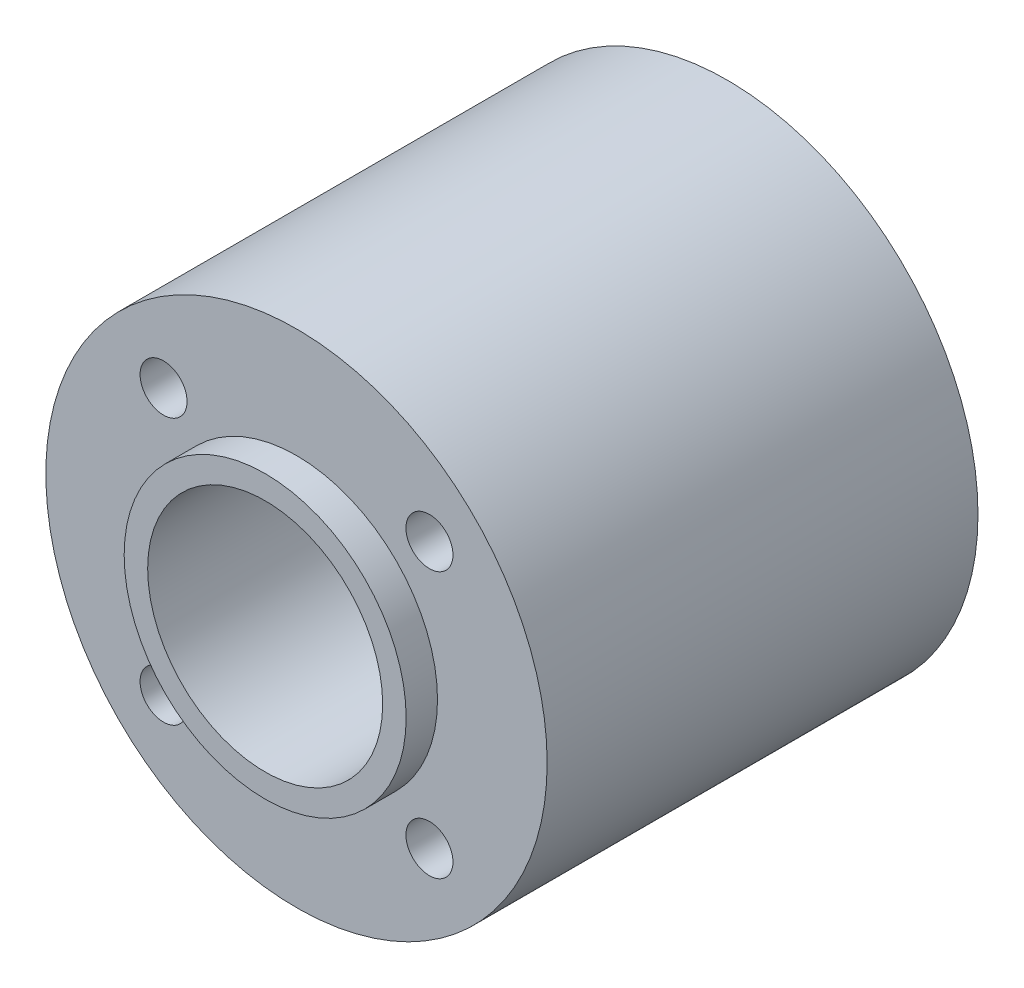
ISO-10303-21;
HEADER;
FILE_DESCRIPTION(('STEP AP214'),'2;1');
FILE_NAME('part.step','',(''),(''),'','','');
FILE_SCHEMA(('AUTOMOTIVE_DESIGN { 1 0 10303 214 1 1 1 1 }'));
ENDSEC;
DATA;
#1=APPLICATION_CONTEXT('core data for automotive mechanical design processes');
#2=APPLICATION_PROTOCOL_DEFINITION('international standard','automotive_design',2000,#1);
#3=PRODUCT_CONTEXT('',#1,'mechanical');
#4=PRODUCT('Part','Part','',(#3));
#5=PRODUCT_RELATED_PRODUCT_CATEGORY('part','',(#4));
#6=PRODUCT_DEFINITION_FORMATION('','',#4);
#7=PRODUCT_DEFINITION_CONTEXT('part definition',#1,'design');
#8=PRODUCT_DEFINITION('design','',#6,#7);
#9=PRODUCT_DEFINITION_SHAPE('','',#8);
#10=(LENGTH_UNIT() NAMED_UNIT(*) SI_UNIT(.MILLI.,.METRE.));
#11=(NAMED_UNIT(*) PLANE_ANGLE_UNIT() SI_UNIT($,.RADIAN.));
#12=(NAMED_UNIT(*) SI_UNIT($,.STERADIAN.) SOLID_ANGLE_UNIT());
#13=UNCERTAINTY_MEASURE_WITH_UNIT(LENGTH_MEASURE(1.E-05),#10,'distance_accuracy_value','');
#14=(GEOMETRIC_REPRESENTATION_CONTEXT(3) GLOBAL_UNCERTAINTY_ASSIGNED_CONTEXT((#13)) GLOBAL_UNIT_ASSIGNED_CONTEXT((#10,
#11,#12)) REPRESENTATION_CONTEXT('',''));
#15=CARTESIAN_POINT('',(0.,0.,0.));
#16=DIRECTION('',(0.,0.,1.));
#17=DIRECTION('',(1.,0.,0.));
#18=AXIS2_PLACEMENT_3D('',#15,#16,#17);
#19=CARTESIAN_POINT('',(0.,0.,27.5));
#20=DIRECTION('',(0.,0.,-1.));
#21=DIRECTION('',(-1.,0.,0.));
#22=AXIS2_PLACEMENT_3D('',#19,#20,#21);
#23=CYLINDRICAL_SURFACE('',#22,16.);
#24=CARTESIAN_POINT('',(0.,0.,27.5));
#25=DIRECTION('',(0.,0.,1.));
#26=DIRECTION('',(1.,0.,0.));
#27=AXIS2_PLACEMENT_3D('',#24,#25,#26);
#28=CIRCLE('',#27,16.);
#29=CARTESIAN_POINT('',(16.,0.,27.5));
#30=VERTEX_POINT('',#29);
#31=EDGE_CURVE('E47',#30,#30,#28,.T.);
#32=ORIENTED_EDGE('',*,*,#31,.F.);
#33=EDGE_LOOP('',(#32));
#34=FACE_BOUND('',#33,.T.);
#35=CARTESIAN_POINT('',(0.,0.,0.));
#36=DIRECTION('',(0.,0.,1.));
#37=DIRECTION('',(1.,0.,0.));
#38=AXIS2_PLACEMENT_3D('',#35,#36,#37);
#39=CIRCLE('',#38,16.);
#40=CARTESIAN_POINT('',(16.,0.,0.));
#41=VERTEX_POINT('',#40);
#42=EDGE_CURVE('E62',#41,#41,#39,.T.);
#43=ORIENTED_EDGE('',*,*,#42,.T.);
#44=EDGE_LOOP('',(#43));
#45=FACE_BOUND('',#44,.T.);
#46=ADVANCED_FACE('F39',(#34,#45),#23,.T.);
#47=CARTESIAN_POINT('',(-8.48528137423862,8.48528137423853,27.5));
#48=DIRECTION('',(0.,0.,-1.));
#49=DIRECTION('',(-1.,0.,0.));
#50=AXIS2_PLACEMENT_3D('',#47,#48,#49);
#51=CYLINDRICAL_SURFACE('',#50,1.5);
#52=CARTESIAN_POINT('',(-8.48528137423862,8.48528137423853,27.5));
#53=DIRECTION('',(0.,0.,1.));
#54=DIRECTION('',(1.,0.,0.));
#55=AXIS2_PLACEMENT_3D('',#52,#53,#54);
#56=CIRCLE('',#55,1.5);
#57=CARTESIAN_POINT('',(-6.98528137423862,8.48528137423853,27.5));
#58=VERTEX_POINT('',#57);
#59=EDGE_CURVE('E52',#58,#58,#56,.T.);
#60=ORIENTED_EDGE('',*,*,#59,.T.);
#61=EDGE_LOOP('',(#60));
#62=FACE_BOUND('',#61,.T.);
#63=CARTESIAN_POINT('',(-8.48528137423862,8.48528137423853,0.));
#64=DIRECTION('',(0.,0.,1.));
#65=DIRECTION('',(1.,0.,0.));
#66=AXIS2_PLACEMENT_3D('',#63,#64,#65);
#67=CIRCLE('',#66,1.5);
#68=CARTESIAN_POINT('',(-6.98528137423862,8.48528137423853,0.));
#69=VERTEX_POINT('',#68);
#70=EDGE_CURVE('E79',#69,#69,#67,.T.);
#71=ORIENTED_EDGE('',*,*,#70,.F.);
#72=EDGE_LOOP('',(#71));
#73=FACE_BOUND('',#72,.T.);
#74=ADVANCED_FACE('F105',(#62,#73),#51,.F.);
#75=CARTESIAN_POINT('',(8.48528137423857,8.48528137423905,27.5));
#76=DIRECTION('',(0.,0.,-1.));
#77=DIRECTION('',(-1.,0.,0.));
#78=AXIS2_PLACEMENT_3D('',#75,#76,#77);
#79=CYLINDRICAL_SURFACE('',#78,1.50000000000044);
#80=CARTESIAN_POINT('',(8.48528137423857,8.48528137423905,27.5));
#81=DIRECTION('',(0.,0.,1.));
#82=DIRECTION('',(1.,0.,0.));
#83=AXIS2_PLACEMENT_3D('',#80,#81,#82);
#84=CIRCLE('',#83,1.50000000000044);
#85=CARTESIAN_POINT('',(9.98528137423901,8.48528137423905,27.5));
#86=VERTEX_POINT('',#85);
#87=EDGE_CURVE('E65',#86,#86,#84,.T.);
#88=ORIENTED_EDGE('',*,*,#87,.T.);
#89=EDGE_LOOP('',(#88));
#90=FACE_BOUND('',#89,.T.);
#91=CARTESIAN_POINT('',(8.48528137423857,8.48528137423905,0.));
#92=DIRECTION('',(0.,0.,1.));
#93=DIRECTION('',(1.,0.,0.));
#94=AXIS2_PLACEMENT_3D('',#91,#92,#93);
#95=CIRCLE('',#94,1.50000000000044);
#96=CARTESIAN_POINT('',(9.98528137423901,8.48528137423905,0.));
#97=VERTEX_POINT('',#96);
#98=EDGE_CURVE('E76',#97,#97,#95,.T.);
#99=ORIENTED_EDGE('',*,*,#98,.F.);
#100=EDGE_LOOP('',(#99));
#101=FACE_BOUND('',#100,.T.);
#102=ADVANCED_FACE('F111',(#90,#101),#79,.F.);
#103=CARTESIAN_POINT('',(8.48528137423905,-8.48528137423809,27.5));
#104=DIRECTION('',(0.,0.,-1.));
#105=DIRECTION('',(-1.,0.,0.));
#106=AXIS2_PLACEMENT_3D('',#103,#104,#105);
#107=CYLINDRICAL_SURFACE('',#106,1.50000000000062);
#108=CARTESIAN_POINT('',(8.48528137423905,-8.48528137423809,27.5));
#109=DIRECTION('',(0.,0.,1.));
#110=DIRECTION('',(1.,0.,0.));
#111=AXIS2_PLACEMENT_3D('',#108,#109,#110);
#112=CIRCLE('',#111,1.50000000000062);
#113=CARTESIAN_POINT('',(9.98528137423967,-8.48528137423809,27.5));
#114=VERTEX_POINT('',#113);
#115=EDGE_CURVE('E61',#114,#114,#112,.T.);
#116=ORIENTED_EDGE('',*,*,#115,.T.);
#117=EDGE_LOOP('',(#116));
#118=FACE_BOUND('',#117,.T.);
#119=CARTESIAN_POINT('',(8.48528137423905,-8.48528137423809,0.));
#120=DIRECTION('',(0.,0.,1.));
#121=DIRECTION('',(1.,0.,0.));
#122=AXIS2_PLACEMENT_3D('',#119,#120,#121);
#123=CIRCLE('',#122,1.50000000000062);
#124=CARTESIAN_POINT('',(9.98528137423967,-8.48528137423809,0.));
#125=VERTEX_POINT('',#124);
#126=EDGE_CURVE('E73',#125,#125,#123,.T.);
#127=ORIENTED_EDGE('',*,*,#126,.F.);
#128=EDGE_LOOP('',(#127));
#129=FACE_BOUND('',#128,.T.);
#130=ADVANCED_FACE('F118',(#118,#129),#107,.F.);
#131=CARTESIAN_POINT('',(-8.48528137423809,-8.48528137423857,27.5));
#132=DIRECTION('',(0.,0.,-1.));
#133=DIRECTION('',(-1.,0.,0.));
#134=AXIS2_PLACEMENT_3D('',#131,#132,#133);
#135=CYLINDRICAL_SURFACE('',#134,1.5000000000002);
#136=CARTESIAN_POINT('',(-8.48528137423809,-8.48528137423857,27.5));
#137=DIRECTION('',(0.,0.,1.));
#138=DIRECTION('',(1.,0.,0.));
#139=AXIS2_PLACEMENT_3D('',#136,#137,#138);
#140=CIRCLE('',#139,1.5000000000002);
#141=CARTESIAN_POINT('',(-6.9852813742379,-8.48528137423857,27.5));
#142=VERTEX_POINT('',#141);
#143=EDGE_CURVE('E58',#142,#142,#140,.T.);
#144=ORIENTED_EDGE('',*,*,#143,.T.);
#145=EDGE_LOOP('',(#144));
#146=FACE_BOUND('',#145,.T.);
#147=CARTESIAN_POINT('',(-8.48528137423809,-8.48528137423857,0.));
#148=DIRECTION('',(0.,0.,1.));
#149=DIRECTION('',(1.,0.,0.));
#150=AXIS2_PLACEMENT_3D('',#147,#148,#149);
#151=CIRCLE('',#150,1.5000000000002);
#152=CARTESIAN_POINT('',(-6.9852813742379,-8.48528137423857,0.));
#153=VERTEX_POINT('',#152);
#154=EDGE_CURVE('E70',#153,#153,#151,.T.);
#155=ORIENTED_EDGE('',*,*,#154,.F.);
#156=EDGE_LOOP('',(#155));
#157=FACE_BOUND('',#156,.T.);
#158=ADVANCED_FACE('F41',(#146,#157),#135,.F.);
#159=CARTESIAN_POINT('',(0.,0.,27.5));
#160=DIRECTION('',(0.,0.,1.));
#161=DIRECTION('',(1.,0.,0.));
#162=AXIS2_PLACEMENT_3D('',#159,#160,#161);
#163=PLANE('',#162);
#164=CARTESIAN_POINT('',(0.,0.,27.5));
#165=DIRECTION('',(0.,0.,1.));
#166=DIRECTION('',(1.,0.,0.));
#167=AXIS2_PLACEMENT_3D('',#164,#165,#166);
#168=CIRCLE('',#167,9.);
#169=CARTESIAN_POINT('',(9.,0.,27.5));
#170=VERTEX_POINT('',#169);
#171=EDGE_CURVE('E10',#170,#170,#168,.T.);
#172=ORIENTED_EDGE('',*,*,#171,.F.);
#173=EDGE_LOOP('',(#172));
#174=FACE_BOUND('',#173,.T.);
#175=ORIENTED_EDGE('',*,*,#143,.F.);
#176=EDGE_LOOP('',(#175));
#177=FACE_BOUND('',#176,.T.);
#178=ORIENTED_EDGE('',*,*,#115,.F.);
#179=EDGE_LOOP('',(#178));
#180=FACE_BOUND('',#179,.T.);
#181=ORIENTED_EDGE('',*,*,#87,.F.);
#182=EDGE_LOOP('',(#181));
#183=FACE_BOUND('',#182,.T.);
#184=ORIENTED_EDGE('',*,*,#59,.F.);
#185=EDGE_LOOP('',(#184));
#186=FACE_BOUND('',#185,.T.);
#187=ORIENTED_EDGE('',*,*,#31,.T.);
#188=EDGE_LOOP('',(#187));
#189=FACE_BOUND('',#188,.T.);
#190=ADVANCED_FACE('F88',(#174,#177,#180,#183,#186,#189),#163,.T.);
#191=CARTESIAN_POINT('',(0.,0.,0.));
#192=DIRECTION('',(0.,0.,1.));
#193=DIRECTION('',(1.,0.,0.));
#194=AXIS2_PLACEMENT_3D('',#191,#192,#193);
#195=PLANE('',#194);
#196=CARTESIAN_POINT('',(0.,0.,0.));
#197=DIRECTION('',(0.,0.,1.));
#198=DIRECTION('',(1.,0.,0.));
#199=AXIS2_PLACEMENT_3D('',#196,#197,#198);
#200=CIRCLE('',#199,9.);
#201=CARTESIAN_POINT('',(9.,0.,0.));
#202=VERTEX_POINT('',#201);
#203=EDGE_CURVE('E43',#202,#202,#200,.T.);
#204=ORIENTED_EDGE('',*,*,#203,.T.);
#205=EDGE_LOOP('',(#204));
#206=FACE_BOUND('',#205,.T.);
#207=ORIENTED_EDGE('',*,*,#154,.T.);
#208=EDGE_LOOP('',(#207));
#209=FACE_BOUND('',#208,.T.);
#210=ORIENTED_EDGE('',*,*,#126,.T.);
#211=EDGE_LOOP('',(#210));
#212=FACE_BOUND('',#211,.T.);
#213=ORIENTED_EDGE('',*,*,#98,.T.);
#214=EDGE_LOOP('',(#213));
#215=FACE_BOUND('',#214,.T.);
#216=ORIENTED_EDGE('',*,*,#70,.T.);
#217=EDGE_LOOP('',(#216));
#218=FACE_BOUND('',#217,.T.);
#219=ORIENTED_EDGE('',*,*,#42,.F.);
#220=EDGE_LOOP('',(#219));
#221=FACE_BOUND('',#220,.T.);
#222=ADVANCED_FACE('F85',(#206,#209,#212,#215,#218,#221),#195,.F.);
#223=CARTESIAN_POINT('',(0.,0.,-2.));
#224=DIRECTION('',(0.,0.,1.));
#225=DIRECTION('',(1.,0.,0.));
#226=AXIS2_PLACEMENT_3D('',#223,#224,#225);
#227=CYLINDRICAL_SURFACE('',#226,9.);
#228=CARTESIAN_POINT('',(0.,0.,-2.));
#229=DIRECTION('',(0.,0.,1.));
#230=DIRECTION('',(1.,0.,0.));
#231=AXIS2_PLACEMENT_3D('',#228,#229,#230);
#232=CIRCLE('',#231,9.);
#233=CARTESIAN_POINT('',(9.,0.,-2.));
#234=VERTEX_POINT('',#233);
#235=EDGE_CURVE('E56',#234,#234,#232,.T.);
#236=CARTESIAN_POINT('',(9.,0.,-2.));
#237=CARTESIAN_POINT('',(9.,0.,-1.97916666666667));
#238=CARTESIAN_POINT('',(9.,0.,-1.95833333333334));
#239=CARTESIAN_POINT('',(9.,0.,-1.91666666666667));
#240=CARTESIAN_POINT('',(9.,0.,-1.89583333333334));
#241=CARTESIAN_POINT('',(9.,0.,-1.85416666666667));
#242=CARTESIAN_POINT('',(9.,0.,-1.83333333333334));
#243=CARTESIAN_POINT('',(9.,0.,-1.79166666666667));
#244=CARTESIAN_POINT('',(9.,0.,-1.77083333333334));
#245=CARTESIAN_POINT('',(9.,0.,-1.72916666666667));
#246=CARTESIAN_POINT('',(9.,0.,-1.70833333333334));
#247=CARTESIAN_POINT('',(9.,0.,-1.66666666666667));
#248=CARTESIAN_POINT('',(9.,0.,-1.64583333333334));
#249=CARTESIAN_POINT('',(9.,0.,-1.60416666666667));
#250=CARTESIAN_POINT('',(9.,0.,-1.58333333333334));
#251=CARTESIAN_POINT('',(9.,0.,-1.54166666666667));
#252=CARTESIAN_POINT('',(9.,0.,-1.52083333333334));
#253=CARTESIAN_POINT('',(9.,0.,-1.47916666666667));
#254=CARTESIAN_POINT('',(9.,0.,-1.45833333333334));
#255=CARTESIAN_POINT('',(9.,0.,-1.41666666666667));
#256=CARTESIAN_POINT('',(9.,0.,-1.39583333333334));
#257=CARTESIAN_POINT('',(9.,0.,-1.35416666666667));
#258=CARTESIAN_POINT('',(9.,0.,-1.33333333333334));
#259=CARTESIAN_POINT('',(9.,0.,-1.29166666666667));
#260=CARTESIAN_POINT('',(9.,0.,-1.27083333333334));
#261=CARTESIAN_POINT('',(9.,0.,-1.22916666666667));
#262=CARTESIAN_POINT('',(9.,0.,-1.20833333333333));
#263=CARTESIAN_POINT('',(9.,0.,-1.16666666666667));
#264=CARTESIAN_POINT('',(9.,0.,-1.14583333333333));
#265=CARTESIAN_POINT('',(9.,0.,-1.10416666666667));
#266=CARTESIAN_POINT('',(9.,0.,-1.08333333333333));
#267=CARTESIAN_POINT('',(9.,0.,-1.04166666666667));
#268=CARTESIAN_POINT('',(9.,0.,-1.02083333333333));
#269=CARTESIAN_POINT('',(9.,0.,-0.979166666666668));
#270=CARTESIAN_POINT('',(9.,0.,-0.958333333333335));
#271=CARTESIAN_POINT('',(9.,0.,-0.916666666666668));
#272=CARTESIAN_POINT('',(9.,0.,-0.895833333333334));
#273=CARTESIAN_POINT('',(9.,0.,-0.854166666666668));
#274=CARTESIAN_POINT('',(9.,0.,-0.833333333333334));
#275=CARTESIAN_POINT('',(9.,0.,-0.791666666666668));
#276=CARTESIAN_POINT('',(9.,0.,-0.770833333333334));
#277=CARTESIAN_POINT('',(9.,0.,-0.729166666666668));
#278=CARTESIAN_POINT('',(9.,0.,-0.708333333333334));
#279=CARTESIAN_POINT('',(9.,0.,-0.666666666666668));
#280=CARTESIAN_POINT('',(9.,0.,-0.645833333333334));
#281=CARTESIAN_POINT('',(9.,0.,-0.604166666666668));
#282=CARTESIAN_POINT('',(9.,0.,-0.583333333333334));
#283=CARTESIAN_POINT('',(9.,0.,-0.541666666666668));
#284=CARTESIAN_POINT('',(9.,0.,-0.520833333333334));
#285=CARTESIAN_POINT('',(9.,0.,-0.479166666666668));
#286=CARTESIAN_POINT('',(9.,0.,-0.458333333333334));
#287=CARTESIAN_POINT('',(9.,0.,-0.416666666666667));
#288=CARTESIAN_POINT('',(9.,0.,-0.395833333333334));
#289=CARTESIAN_POINT('',(9.,0.,-0.354166666666667));
#290=CARTESIAN_POINT('',(9.,0.,-0.333333333333334));
#291=CARTESIAN_POINT('',(9.,0.,-0.291666666666667));
#292=CARTESIAN_POINT('',(9.,0.,-0.270833333333334));
#293=CARTESIAN_POINT('',(9.,0.,-0.229166666666667));
#294=CARTESIAN_POINT('',(9.,0.,-0.208333333333334));
#295=CARTESIAN_POINT('',(9.,0.,-0.166666666666667));
#296=CARTESIAN_POINT('',(9.,0.,-0.145833333333334));
#297=CARTESIAN_POINT('',(9.,0.,-0.104166666666667));
#298=CARTESIAN_POINT('',(9.,0.,-0.0833333333333338));
#299=CARTESIAN_POINT('',(9.,0.,-0.0416666666666671));
#300=CARTESIAN_POINT('',(9.,0.,-0.0208333333333338));
#301=CARTESIAN_POINT('',(9.,0.,0.));
#302=B_SPLINE_CURVE_WITH_KNOTS('',3,(#236,#237,#238,#239,#240,#241,#242,#243,#244,#245,#246,
#247,#248,#249,#250,#251,#252,#253,#254,#255,#256,#257,#258,#259,#260,#261,#262,#263,#264,#265,
#266,#267,#268,#269,#270,#271,#272,#273,#274,#275,#276,#277,#278,#279,#280,#281,#282,#283,#284,
#285,#286,#287,#288,#289,#290,#291,#292,#293,#294,#295,#296,#297,#298,#299,#300,#301),
.UNSPECIFIED.,.F.,.F.,(4,2,2,2,2,2,2,2,2,2,2,2,2,2,2,2,2,2,2,2,2,2,2,2,2,2,2,2,2,2,2,2,4),(0.,
0.0624999999999998,0.125,0.1875,0.25,0.3125,0.375,0.4375,0.5,0.5625,0.625,0.6875,0.75,0.8125,
0.875,0.9375,1.,1.0625,1.125,1.1875,1.25,1.3125,1.375,1.4375,1.5,1.5625,1.625,1.6875,1.75,
1.8125,1.875,1.9375,2.),.UNSPECIFIED.);
#303=EDGE_CURVE('BSEAM87',#234,#202,#302,.T.);
#304=ORIENTED_EDGE('',*,*,#235,.T.);
#305=ORIENTED_EDGE('',*,*,#203,.F.);
#306=ORIENTED_EDGE('',*,*,#303,.T.);
#307=ORIENTED_EDGE('',*,*,#303,.F.);
#308=EDGE_LOOP('',(#304,#306,#305,#307));
#309=FACE_BOUND('',#308,.T.);
#310=ADVANCED_FACE('F87',(#309),#227,.T.);
#311=CARTESIAN_POINT('',(0.,0.,-2.));
#312=DIRECTION('',(0.,0.,1.));
#313=DIRECTION('',(1.,0.,0.));
#314=AXIS2_PLACEMENT_3D('',#311,#312,#313);
#315=PLANE('',#314);
#316=CARTESIAN_POINT('',(0.,0.,-2.));
#317=DIRECTION('',(0.,0.,1.));
#318=DIRECTION('',(1.,0.,0.));
#319=AXIS2_PLACEMENT_3D('',#316,#317,#318);
#320=CIRCLE('',#319,7.5);
#321=CARTESIAN_POINT('',(7.5,0.,-2.));
#322=VERTEX_POINT('',#321);
#323=EDGE_CURVE('E212',#322,#322,#320,.T.);
#324=ORIENTED_EDGE('',*,*,#323,.T.);
#325=EDGE_LOOP('',(#324));
#326=FACE_BOUND('',#325,.T.);
#327=ORIENTED_EDGE('',*,*,#235,.F.);
#328=EDGE_LOOP('',(#327));
#329=FACE_BOUND('',#328,.T.);
#330=ADVANCED_FACE('F95',(#326,#329),#315,.F.);
#331=CARTESIAN_POINT('',(0.,0.,27.5));
#332=DIRECTION('',(0.,0.,-1.));
#333=DIRECTION('',(-1.,0.,0.));
#334=AXIS2_PLACEMENT_3D('',#331,#332,#333);
#335=CYLINDRICAL_SURFACE('',#334,7.5);
#336=ORIENTED_EDGE('',*,*,#323,.F.);
#337=EDGE_LOOP('',(#336));
#338=FACE_BOUND('',#337,.T.);
#339=CARTESIAN_POINT('',(0.,0.,29.5));
#340=DIRECTION('',(0.,0.,1.));
#341=DIRECTION('',(1.,0.,0.));
#342=AXIS2_PLACEMENT_3D('',#339,#340,#341);
#343=CIRCLE('',#342,7.5);
#344=CARTESIAN_POINT('',(7.5,0.,29.5));
#345=VERTEX_POINT('',#344);
#346=EDGE_CURVE('E209',#345,#345,#343,.T.);
#347=ORIENTED_EDGE('',*,*,#346,.T.);
#348=EDGE_LOOP('',(#347));
#349=FACE_BOUND('',#348,.T.);
#350=ADVANCED_FACE('F115',(#338,#349),#335,.F.);
#351=CARTESIAN_POINT('',(0.,0.,29.5));
#352=DIRECTION('',(0.,0.,1.));
#353=DIRECTION('',(1.,0.,0.));
#354=AXIS2_PLACEMENT_3D('',#351,#352,#353);
#355=CIRCLE('',#354,9.);
#356=CARTESIAN_POINT('',(9.,0.,29.5));
#357=VERTEX_POINT('',#356);
#358=EDGE_CURVE('E206',#357,#357,#355,.T.);
#359=CARTESIAN_POINT('',(9.,0.,27.5));
#360=CARTESIAN_POINT('',(9.,0.,27.5208333333333));
#361=CARTESIAN_POINT('',(9.,0.,27.5416666666667));
#362=CARTESIAN_POINT('',(9.,0.,27.5833333333333));
#363=CARTESIAN_POINT('',(9.,0.,27.6041666666667));
#364=CARTESIAN_POINT('',(9.,0.,27.6458333333333));
#365=CARTESIAN_POINT('',(9.,0.,27.6666666666667));
#366=CARTESIAN_POINT('',(9.,0.,27.7083333333333));
#367=CARTESIAN_POINT('',(9.,0.,27.7291666666667));
#368=CARTESIAN_POINT('',(9.,0.,27.7708333333333));
#369=CARTESIAN_POINT('',(9.,0.,27.7916666666667));
#370=CARTESIAN_POINT('',(9.,0.,27.8333333333333));
#371=CARTESIAN_POINT('',(9.,0.,27.8541666666667));
#372=CARTESIAN_POINT('',(9.,0.,27.8958333333333));
#373=CARTESIAN_POINT('',(9.,0.,27.9166666666667));
#374=CARTESIAN_POINT('',(9.,0.,27.9583333333333));
#375=CARTESIAN_POINT('',(9.,0.,27.9791666666667));
#376=CARTESIAN_POINT('',(9.,0.,28.0208333333333));
#377=CARTESIAN_POINT('',(9.,0.,28.0416666666667));
#378=CARTESIAN_POINT('',(9.,0.,28.0833333333333));
#379=CARTESIAN_POINT('',(9.,0.,28.1041666666667));
#380=CARTESIAN_POINT('',(9.,0.,28.1458333333333));
#381=CARTESIAN_POINT('',(9.,0.,28.1666666666667));
#382=CARTESIAN_POINT('',(9.,0.,28.2083333333333));
#383=CARTESIAN_POINT('',(9.,0.,28.2291666666667));
#384=CARTESIAN_POINT('',(9.,0.,28.2708333333333));
#385=CARTESIAN_POINT('',(9.,0.,28.2916666666667));
#386=CARTESIAN_POINT('',(9.,0.,28.3333333333333));
#387=CARTESIAN_POINT('',(9.,0.,28.3541666666667));
#388=CARTESIAN_POINT('',(9.,0.,28.3958333333333));
#389=CARTESIAN_POINT('',(9.,0.,28.4166666666667));
#390=CARTESIAN_POINT('',(9.,0.,28.4583333333333));
#391=CARTESIAN_POINT('',(9.,0.,28.4791666666667));
#392=CARTESIAN_POINT('',(9.,0.,28.5208333333333));
#393=CARTESIAN_POINT('',(9.,0.,28.5416666666667));
#394=CARTESIAN_POINT('',(9.,0.,28.5833333333333));
#395=CARTESIAN_POINT('',(9.,0.,28.6041666666667));
#396=CARTESIAN_POINT('',(9.,0.,28.6458333333333));
#397=CARTESIAN_POINT('',(9.,0.,28.6666666666667));
#398=CARTESIAN_POINT('',(9.,0.,28.7083333333333));
#399=CARTESIAN_POINT('',(9.,0.,28.7291666666667));
#400=CARTESIAN_POINT('',(9.,0.,28.7708333333333));
#401=CARTESIAN_POINT('',(9.,0.,28.7916666666667));
#402=CARTESIAN_POINT('',(9.,0.,28.8333333333333));
#403=CARTESIAN_POINT('',(9.,0.,28.8541666666667));
#404=CARTESIAN_POINT('',(9.,0.,28.8958333333333));
#405=CARTESIAN_POINT('',(9.,0.,28.9166666666667));
#406=CARTESIAN_POINT('',(9.,0.,28.9583333333333));
#407=CARTESIAN_POINT('',(9.,0.,28.9791666666667));
#408=CARTESIAN_POINT('',(9.,0.,29.0208333333333));
#409=CARTESIAN_POINT('',(9.,0.,29.0416666666667));
#410=CARTESIAN_POINT('',(9.,0.,29.0833333333333));
#411=CARTESIAN_POINT('',(9.,0.,29.1041666666667));
#412=CARTESIAN_POINT('',(9.,0.,29.1458333333333));
#413=CARTESIAN_POINT('',(9.,0.,29.1666666666667));
#414=CARTESIAN_POINT('',(9.,0.,29.2083333333333));
#415=CARTESIAN_POINT('',(9.,0.,29.2291666666667));
#416=CARTESIAN_POINT('',(9.,0.,29.2708333333333));
#417=CARTESIAN_POINT('',(9.,0.,29.2916666666667));
#418=CARTESIAN_POINT('',(9.,0.,29.3333333333333));
#419=CARTESIAN_POINT('',(9.,0.,29.3541666666667));
#420=CARTESIAN_POINT('',(9.,0.,29.3958333333333));
#421=CARTESIAN_POINT('',(9.,0.,29.4166666666667));
#422=CARTESIAN_POINT('',(9.,0.,29.4583333333333));
#423=CARTESIAN_POINT('',(9.,0.,29.4791666666667));
#424=CARTESIAN_POINT('',(9.,0.,29.5));
#425=B_SPLINE_CURVE_WITH_KNOTS('',3,(#359,#360,#361,#362,#363,#364,#365,#366,#367,#368,#369,
#370,#371,#372,#373,#374,#375,#376,#377,#378,#379,#380,#381,#382,#383,#384,#385,#386,#387,#388,
#389,#390,#391,#392,#393,#394,#395,#396,#397,#398,#399,#400,#401,#402,#403,#404,#405,#406,#407,
#408,#409,#410,#411,#412,#413,#414,#415,#416,#417,#418,#419,#420,#421,#422,#423,#424),
.UNSPECIFIED.,.F.,.F.,(4,2,2,2,2,2,2,2,2,2,2,2,2,2,2,2,2,2,2,2,2,2,2,2,2,2,2,2,2,2,2,2,4),(0.,
0.0625000000000001,0.125,0.1875,0.25,0.3125,0.375,0.4375,0.5,0.562499999999997,
0.624999999999997,0.687499999999997,0.749999999999997,0.812499999999997,0.874999999999997,
0.937499999999997,0.999999999999997,1.0625,1.125,1.1875,1.25,1.3125,1.375,1.4375,
1.49999999999999,1.56249999999999,1.62499999999999,1.68749999999999,1.74999999999999,
1.81249999999999,1.87499999999999,1.93749999999999,1.99999999999999),.UNSPECIFIED.);
#426=EDGE_CURVE('BSEAM98',#170,#357,#425,.T.);
#427=ORIENTED_EDGE('',*,*,#171,.T.);
#428=ORIENTED_EDGE('',*,*,#358,.F.);
#429=ORIENTED_EDGE('',*,*,#426,.T.);
#430=ORIENTED_EDGE('',*,*,#426,.F.);
#431=EDGE_LOOP('',(#427,#429,#428,#430));
#432=FACE_BOUND('',#431,.T.);
#433=ADVANCED_FACE('F98',(#432),#227,.T.);
#434=CARTESIAN_POINT('',(0.,0.,29.5));
#435=DIRECTION('',(0.,0.,1.));
#436=DIRECTION('',(1.,0.,0.));
#437=AXIS2_PLACEMENT_3D('',#434,#435,#436);
#438=PLANE('',#437);
#439=ORIENTED_EDGE('',*,*,#358,.T.);
#440=EDGE_LOOP('',(#439));
#441=FACE_BOUND('',#440,.T.);
#442=ORIENTED_EDGE('',*,*,#346,.F.);
#443=EDGE_LOOP('',(#442));
#444=FACE_BOUND('',#443,.T.);
#445=ADVANCED_FACE('F191',(#441,#444),#438,.T.);
#446=CLOSED_SHELL('',(#46,#74,#102,#130,#158,#190,#222,#310,#330,#350,#433,#445));
#447=MANIFOLD_SOLID_BREP('B2',#446);
#448=ADVANCED_BREP_SHAPE_REPRESENTATION('',(#18,#447),#14);
#449=SHAPE_DEFINITION_REPRESENTATION(#9,#448);
ENDSEC;
END-ISO-10303-21;
